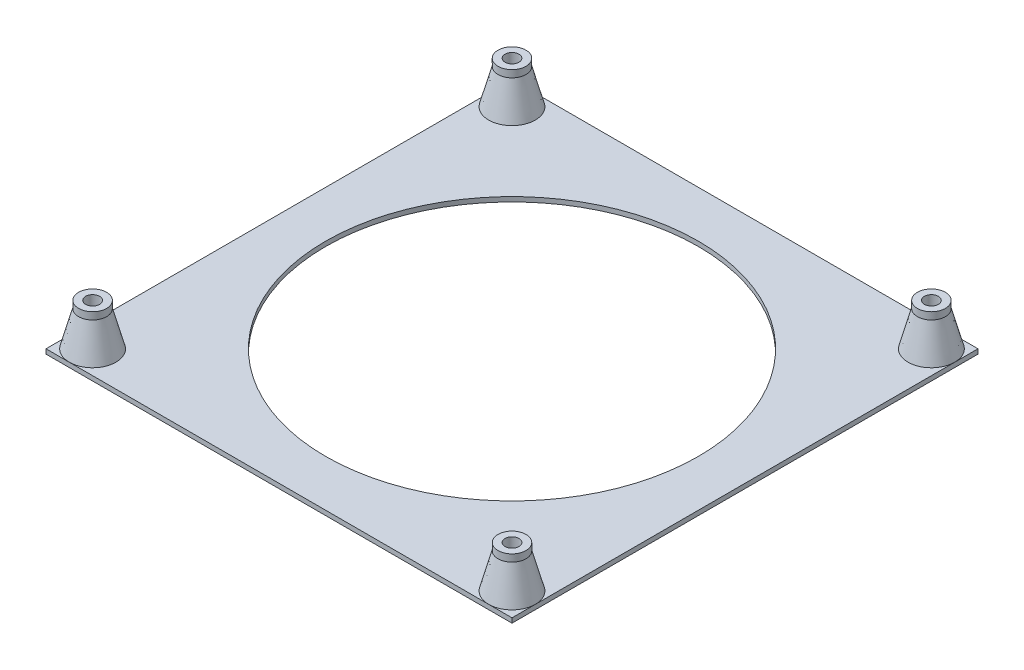
ISO-10303-21;
HEADER;
FILE_DESCRIPTION(('STEP AP214'),'2;1');
FILE_NAME('part.step','',(''),(''),'','','');
FILE_SCHEMA(('AUTOMOTIVE_DESIGN { 1 0 10303 214 1 1 1 1 }'));
ENDSEC;
DATA;
#1=APPLICATION_CONTEXT('core data for automotive mechanical design processes');
#2=APPLICATION_PROTOCOL_DEFINITION('international standard','automotive_design',2000,#1);
#3=PRODUCT_CONTEXT('',#1,'mechanical');
#4=PRODUCT('Part','Part','',(#3));
#5=PRODUCT_RELATED_PRODUCT_CATEGORY('part','',(#4));
#6=PRODUCT_DEFINITION_FORMATION('','',#4);
#7=PRODUCT_DEFINITION_CONTEXT('part definition',#1,'design');
#8=PRODUCT_DEFINITION('design','',#6,#7);
#9=PRODUCT_DEFINITION_SHAPE('','',#8);
#10=(LENGTH_UNIT() NAMED_UNIT(*) SI_UNIT(.MILLI.,.METRE.));
#11=(NAMED_UNIT(*) PLANE_ANGLE_UNIT() SI_UNIT($,.RADIAN.));
#12=(NAMED_UNIT(*) SI_UNIT($,.STERADIAN.) SOLID_ANGLE_UNIT());
#13=UNCERTAINTY_MEASURE_WITH_UNIT(LENGTH_MEASURE(1.E-05),#10,'distance_accuracy_value','');
#14=(GEOMETRIC_REPRESENTATION_CONTEXT(3) GLOBAL_UNCERTAINTY_ASSIGNED_CONTEXT((#13)) GLOBAL_UNIT_ASSIGNED_CONTEXT((#10,
#11,#12)) REPRESENTATION_CONTEXT('',''));
#15=CARTESIAN_POINT('',(0.,0.,0.));
#16=DIRECTION('',(0.,0.,1.));
#17=DIRECTION('',(1.,0.,0.));
#18=AXIS2_PLACEMENT_3D('',#15,#16,#17);
#19=CARTESIAN_POINT('',(0.,1.,0.));
#20=DIRECTION('',(0.,1.,0.));
#21=DIRECTION('',(0.,0.,1.));
#22=AXIS2_PLACEMENT_3D('',#19,#20,#21);
#23=PLANE('',#22);
#24=CARTESIAN_POINT('',(0.,1.,0.));
#25=DIRECTION('',(0.,1.,0.));
#26=DIRECTION('',(0.,0.,1.));
#27=AXIS2_PLACEMENT_3D('',#24,#25,#26);
#28=CIRCLE('',#27,40.);
#29=CARTESIAN_POINT('',(0.,1.,40.));
#30=VERTEX_POINT('',#29);
#31=EDGE_CURVE('E231',#30,#30,#28,.T.);
#32=ORIENTED_EDGE('',*,*,#31,.F.);
#33=EDGE_LOOP('',(#32));
#34=FACE_BOUND('',#33,.T.);
#35=DIRECTION('',(1.,0.,0.));
#36=VECTOR('',#35,1.);
#37=CARTESIAN_POINT('',(50.,1.,50.));
#38=LINE('',#37,#36);
#39=CARTESIAN_POINT('',(-45.,1.,50.));
#40=VERTEX_POINT('',#39);
#41=CARTESIAN_POINT('',(45.,1.,50.));
#42=VERTEX_POINT('',#41);
#43=EDGE_CURVE('E127',#40,#42,#38,.T.);
#44=ORIENTED_EDGE('',*,*,#43,.T.);
#45=CARTESIAN_POINT('',(45.,1.,45.));
#46=DIRECTION('',(0.,1.,0.));
#47=DIRECTION('',(0.,0.,1.));
#48=AXIS2_PLACEMENT_3D('',#45,#46,#47);
#49=CIRCLE('',#48,4.99999999999998);
#50=CARTESIAN_POINT('',(50.,1.,45.));
#51=VERTEX_POINT('',#50);
#52=EDGE_CURVE('E157',#42,#51,#49,.F.);
#53=ORIENTED_EDGE('',*,*,#52,.T.);
#54=DIRECTION('',(0.,0.,-1.));
#55=VECTOR('',#54,1.);
#56=CARTESIAN_POINT('',(50.,1.,50.));
#57=LINE('',#56,#55);
#58=CARTESIAN_POINT('',(50.,1.,-45.));
#59=VERTEX_POINT('',#58);
#60=EDGE_CURVE('E208',#51,#59,#57,.T.);
#61=ORIENTED_EDGE('',*,*,#60,.T.);
#62=CARTESIAN_POINT('',(45.,1.,-45.));
#63=DIRECTION('',(0.,1.,0.));
#64=DIRECTION('',(0.,0.,1.));
#65=AXIS2_PLACEMENT_3D('',#62,#63,#64);
#66=CIRCLE('',#65,4.99999999999998);
#67=CARTESIAN_POINT('',(45.,1.,-50.));
#68=VERTEX_POINT('',#67);
#69=EDGE_CURVE('E60',#59,#68,#66,.F.);
#70=ORIENTED_EDGE('',*,*,#69,.T.);
#71=DIRECTION('',(-1.,0.,0.));
#72=VECTOR('',#71,1.);
#73=CARTESIAN_POINT('',(50.,1.,-50.));
#74=LINE('',#73,#72);
#75=CARTESIAN_POINT('',(-45.,1.,-50.));
#76=VERTEX_POINT('',#75);
#77=EDGE_CURVE('E210',#68,#76,#74,.T.);
#78=ORIENTED_EDGE('',*,*,#77,.T.);
#79=CARTESIAN_POINT('',(-45.,1.,-45.));
#80=DIRECTION('',(0.,1.,0.));
#81=DIRECTION('',(0.,0.,1.));
#82=AXIS2_PLACEMENT_3D('',#79,#80,#81);
#83=CIRCLE('',#82,4.99999999999998);
#84=CARTESIAN_POINT('',(-50.,1.,-45.));
#85=VERTEX_POINT('',#84);
#86=EDGE_CURVE('E52',#76,#85,#83,.F.);
#87=ORIENTED_EDGE('',*,*,#86,.T.);
#88=DIRECTION('',(0.,0.,1.));
#89=VECTOR('',#88,1.);
#90=CARTESIAN_POINT('',(-50.,1.,50.));
#91=LINE('',#90,#89);
#92=CARTESIAN_POINT('',(-50.,1.,45.));
#93=VERTEX_POINT('',#92);
#94=EDGE_CURVE('E115',#85,#93,#91,.T.);
#95=ORIENTED_EDGE('',*,*,#94,.T.);
#96=CARTESIAN_POINT('',(-45.,1.,45.));
#97=DIRECTION('',(0.,1.,0.));
#98=DIRECTION('',(0.,0.,1.));
#99=AXIS2_PLACEMENT_3D('',#96,#97,#98);
#100=CIRCLE('',#99,4.99999999999998);
#101=EDGE_CURVE('E139',#93,#40,#100,.F.);
#102=ORIENTED_EDGE('',*,*,#101,.T.);
#103=EDGE_LOOP('',(#44,#53,#61,#70,#78,#87,#95,#102));
#104=FACE_BOUND('',#103,.T.);
#105=ADVANCED_FACE('F37',(#34,#104),#23,.T.);
#106=CARTESIAN_POINT('',(50.,1.,-50.));
#107=VERTEX_POINT('',#106);
#108=EDGE_CURVE('E212',#107,#68,#74,.T.);
#109=ORIENTED_EDGE('',*,*,#108,.T.);
#110=CARTESIAN_POINT('',(45.,1.,-45.));
#111=DIRECTION('',(0.,1.,0.));
#112=DIRECTION('',(0.,0.,1.));
#113=AXIS2_PLACEMENT_3D('',#110,#111,#112);
#114=CIRCLE('',#113,4.99999999999998);
#115=EDGE_CURVE('E152',#68,#59,#114,.F.);
#116=ORIENTED_EDGE('',*,*,#115,.T.);
#117=EDGE_CURVE('E128',#59,#107,#57,.T.);
#118=ORIENTED_EDGE('',*,*,#117,.T.);
#119=EDGE_LOOP('',(#109,#116,#118));
#120=FACE_BOUND('',#119,.T.);
#121=ADVANCED_FACE('F181',(#120),#23,.T.);
#122=CARTESIAN_POINT('',(-50.,1.,-50.));
#123=VERTEX_POINT('',#122);
#124=EDGE_CURVE('E118',#123,#85,#91,.T.);
#125=ORIENTED_EDGE('',*,*,#124,.T.);
#126=CARTESIAN_POINT('',(-45.,1.,-45.));
#127=DIRECTION('',(0.,1.,0.));
#128=DIRECTION('',(0.,0.,1.));
#129=AXIS2_PLACEMENT_3D('',#126,#127,#128);
#130=CIRCLE('',#129,4.99999999999998);
#131=EDGE_CURVE('E149',#85,#76,#130,.F.);
#132=ORIENTED_EDGE('',*,*,#131,.T.);
#133=EDGE_CURVE('E207',#76,#123,#74,.T.);
#134=ORIENTED_EDGE('',*,*,#133,.T.);
#135=EDGE_LOOP('',(#125,#132,#134));
#136=FACE_BOUND('',#135,.T.);
#137=ADVANCED_FACE('F188',(#136),#23,.T.);
#138=CARTESIAN_POINT('',(-50.,1.,50.));
#139=VERTEX_POINT('',#138);
#140=EDGE_CURVE('E108',#139,#40,#38,.T.);
#141=ORIENTED_EDGE('',*,*,#140,.T.);
#142=CARTESIAN_POINT('',(-45.,1.,45.));
#143=DIRECTION('',(0.,1.,0.));
#144=DIRECTION('',(0.,0.,1.));
#145=AXIS2_PLACEMENT_3D('',#142,#143,#144);
#146=CIRCLE('',#145,4.99999999999998);
#147=EDGE_CURVE('E110',#40,#93,#146,.F.);
#148=ORIENTED_EDGE('',*,*,#147,.T.);
#149=EDGE_CURVE('E105',#93,#139,#91,.T.);
#150=ORIENTED_EDGE('',*,*,#149,.T.);
#151=EDGE_LOOP('',(#141,#148,#150));
#152=FACE_BOUND('',#151,.T.);
#153=ADVANCED_FACE('F107',(#152),#23,.T.);
#154=CARTESIAN_POINT('',(50.,1.,50.));
#155=VERTEX_POINT('',#154);
#156=EDGE_CURVE('E203',#155,#51,#57,.T.);
#157=ORIENTED_EDGE('',*,*,#156,.T.);
#158=CARTESIAN_POINT('',(45.,1.,45.));
#159=DIRECTION('',(0.,1.,0.));
#160=DIRECTION('',(0.,0.,1.));
#161=AXIS2_PLACEMENT_3D('',#158,#159,#160);
#162=CIRCLE('',#161,4.99999999999998);
#163=EDGE_CURVE('E155',#51,#42,#162,.F.);
#164=ORIENTED_EDGE('',*,*,#163,.T.);
#165=EDGE_CURVE('E130',#42,#155,#38,.T.);
#166=ORIENTED_EDGE('',*,*,#165,.T.);
#167=EDGE_LOOP('',(#157,#164,#166));
#168=FACE_BOUND('',#167,.T.);
#169=ADVANCED_FACE('F184',(#168),#23,.T.);
#170=CARTESIAN_POINT('',(0.,0.,0.));
#171=DIRECTION('',(0.,1.,0.));
#172=DIRECTION('',(0.,0.,1.));
#173=AXIS2_PLACEMENT_3D('',#170,#171,#172);
#174=PLANE('',#173);
#175=CARTESIAN_POINT('',(-45.,0.,-45.));
#176=DIRECTION('',(0.,1.,0.));
#177=DIRECTION('',(0.,0.,1.));
#178=AXIS2_PLACEMENT_3D('',#175,#176,#177);
#179=CIRCLE('',#178,1.5);
#180=CARTESIAN_POINT('',(-45.,0.,-43.5));
#181=VERTEX_POINT('',#180);
#182=EDGE_CURVE('E501',#181,#181,#179,.T.);
#183=ORIENTED_EDGE('',*,*,#182,.T.);
#184=EDGE_LOOP('',(#183));
#185=FACE_BOUND('',#184,.T.);
#186=CARTESIAN_POINT('',(45.,0.,-45.));
#187=DIRECTION('',(0.,1.,0.));
#188=DIRECTION('',(0.,0.,1.));
#189=AXIS2_PLACEMENT_3D('',#186,#187,#188);
#190=CIRCLE('',#189,1.5);
#191=CARTESIAN_POINT('',(45.,0.,-43.5));
#192=VERTEX_POINT('',#191);
#193=EDGE_CURVE('E488',#192,#192,#190,.T.);
#194=ORIENTED_EDGE('',*,*,#193,.T.);
#195=EDGE_LOOP('',(#194));
#196=FACE_BOUND('',#195,.T.);
#197=CARTESIAN_POINT('',(45.,0.,45.));
#198=DIRECTION('',(0.,1.,0.));
#199=DIRECTION('',(0.,0.,1.));
#200=AXIS2_PLACEMENT_3D('',#197,#198,#199);
#201=CIRCLE('',#200,1.5);
#202=CARTESIAN_POINT('',(45.,0.,46.5));
#203=VERTEX_POINT('',#202);
#204=EDGE_CURVE('E258',#203,#203,#201,.T.);
#205=ORIENTED_EDGE('',*,*,#204,.T.);
#206=EDGE_LOOP('',(#205));
#207=FACE_BOUND('',#206,.T.);
#208=CARTESIAN_POINT('',(-45.,0.,45.));
#209=DIRECTION('',(0.,1.,0.));
#210=DIRECTION('',(0.,0.,1.));
#211=AXIS2_PLACEMENT_3D('',#208,#209,#210);
#212=CIRCLE('',#211,1.5);
#213=CARTESIAN_POINT('',(-45.,0.,46.5));
#214=VERTEX_POINT('',#213);
#215=EDGE_CURVE('E261',#214,#214,#212,.T.);
#216=ORIENTED_EDGE('',*,*,#215,.T.);
#217=EDGE_LOOP('',(#216));
#218=FACE_BOUND('',#217,.T.);
#219=DIRECTION('',(0.,0.,1.));
#220=VECTOR('',#219,1.);
#221=CARTESIAN_POINT('',(-50.,0.,50.));
#222=LINE('',#221,#220);
#223=CARTESIAN_POINT('',(-50.,0.,-50.));
#224=VERTEX_POINT('',#223);
#225=CARTESIAN_POINT('',(-50.,0.,50.));
#226=VERTEX_POINT('',#225);
#227=EDGE_CURVE('E134',#224,#226,#222,.T.);
#228=ORIENTED_EDGE('',*,*,#227,.F.);
#229=DIRECTION('',(-1.,0.,0.));
#230=VECTOR('',#229,1.);
#231=CARTESIAN_POINT('',(50.,0.,-50.));
#232=LINE('',#231,#230);
#233=CARTESIAN_POINT('',(50.,0.,-50.));
#234=VERTEX_POINT('',#233);
#235=EDGE_CURVE('E116',#234,#224,#232,.T.);
#236=ORIENTED_EDGE('',*,*,#235,.F.);
#237=DIRECTION('',(0.,0.,-1.));
#238=VECTOR('',#237,1.);
#239=CARTESIAN_POINT('',(50.,0.,50.));
#240=LINE('',#239,#238);
#241=CARTESIAN_POINT('',(50.,0.,50.));
#242=VERTEX_POINT('',#241);
#243=EDGE_CURVE('E221',#242,#234,#240,.T.);
#244=ORIENTED_EDGE('',*,*,#243,.F.);
#245=DIRECTION('',(1.,0.,0.));
#246=VECTOR('',#245,1.);
#247=CARTESIAN_POINT('',(50.,0.,50.));
#248=LINE('',#247,#246);
#249=EDGE_CURVE('E230',#226,#242,#248,.T.);
#250=ORIENTED_EDGE('',*,*,#249,.F.);
#251=EDGE_LOOP('',(#228,#236,#244,#250));
#252=FACE_BOUND('',#251,.T.);
#253=CARTESIAN_POINT('',(0.,0.,0.));
#254=DIRECTION('',(0.,1.,0.));
#255=DIRECTION('',(0.,0.,1.));
#256=AXIS2_PLACEMENT_3D('',#253,#254,#255);
#257=CIRCLE('',#256,40.);
#258=CARTESIAN_POINT('',(0.,0.,40.));
#259=VERTEX_POINT('',#258);
#260=EDGE_CURVE('E273',#259,#259,#257,.T.);
#261=ORIENTED_EDGE('',*,*,#260,.T.);
#262=EDGE_LOOP('',(#261));
#263=FACE_BOUND('',#262,.T.);
#264=ADVANCED_FACE('F194',(#185,#196,#207,#218,#252,#263),#174,.F.);
#265=CARTESIAN_POINT('',(-50.,1.,50.));
#266=DIRECTION('',(1.,0.,0.));
#267=DIRECTION('',(0.,0.,-1.));
#268=AXIS2_PLACEMENT_3D('',#265,#266,#267);
#269=PLANE('',#268);
#270=ORIENTED_EDGE('',*,*,#227,.T.);
#271=DIRECTION('',(0.,-1.,0.));
#272=VECTOR('',#271,1.);
#273=CARTESIAN_POINT('',(-50.,1.,50.));
#274=LINE('',#273,#272);
#275=EDGE_CURVE('E123',#139,#226,#274,.T.);
#276=ORIENTED_EDGE('',*,*,#275,.F.);
#277=ORIENTED_EDGE('',*,*,#149,.F.);
#278=ORIENTED_EDGE('',*,*,#94,.F.);
#279=ORIENTED_EDGE('',*,*,#124,.F.);
#280=DIRECTION('',(0.,-1.,0.));
#281=VECTOR('',#280,1.);
#282=CARTESIAN_POINT('',(-50.,1.,-50.));
#283=LINE('',#282,#281);
#284=EDGE_CURVE('E224',#123,#224,#283,.T.);
#285=ORIENTED_EDGE('',*,*,#284,.T.);
#286=EDGE_LOOP('',(#270,#276,#277,#278,#279,#285));
#287=FACE_BOUND('',#286,.T.);
#288=ADVANCED_FACE('F131',(#287),#269,.F.);
#289=CARTESIAN_POINT('',(50.,1.,50.));
#290=DIRECTION('',(0.,0.,-1.));
#291=DIRECTION('',(-1.,0.,0.));
#292=AXIS2_PLACEMENT_3D('',#289,#290,#291);
#293=PLANE('',#292);
#294=ORIENTED_EDGE('',*,*,#249,.T.);
#295=DIRECTION('',(0.,-1.,0.));
#296=VECTOR('',#295,1.);
#297=CARTESIAN_POINT('',(50.,1.,50.));
#298=LINE('',#297,#296);
#299=EDGE_CURVE('E136',#155,#242,#298,.T.);
#300=ORIENTED_EDGE('',*,*,#299,.F.);
#301=ORIENTED_EDGE('',*,*,#165,.F.);
#302=ORIENTED_EDGE('',*,*,#43,.F.);
#303=ORIENTED_EDGE('',*,*,#140,.F.);
#304=ORIENTED_EDGE('',*,*,#275,.T.);
#305=EDGE_LOOP('',(#294,#300,#301,#302,#303,#304));
#306=FACE_BOUND('',#305,.T.);
#307=ADVANCED_FACE('F122',(#306),#293,.F.);
#308=CARTESIAN_POINT('',(50.,1.,50.));
#309=DIRECTION('',(-1.,0.,0.));
#310=DIRECTION('',(0.,0.,1.));
#311=AXIS2_PLACEMENT_3D('',#308,#309,#310);
#312=PLANE('',#311);
#313=ORIENTED_EDGE('',*,*,#243,.T.);
#314=DIRECTION('',(0.,-1.,0.));
#315=VECTOR('',#314,1.);
#316=CARTESIAN_POINT('',(50.,1.,-50.));
#317=LINE('',#316,#315);
#318=EDGE_CURVE('E142',#107,#234,#317,.T.);
#319=ORIENTED_EDGE('',*,*,#318,.F.);
#320=ORIENTED_EDGE('',*,*,#117,.F.);
#321=ORIENTED_EDGE('',*,*,#60,.F.);
#322=ORIENTED_EDGE('',*,*,#156,.F.);
#323=ORIENTED_EDGE('',*,*,#299,.T.);
#324=EDGE_LOOP('',(#313,#319,#320,#321,#322,#323));
#325=FACE_BOUND('',#324,.T.);
#326=ADVANCED_FACE('F219',(#325),#312,.F.);
#327=CARTESIAN_POINT('',(50.,1.,-50.));
#328=DIRECTION('',(0.,0.,1.));
#329=DIRECTION('',(1.,0.,0.));
#330=AXIS2_PLACEMENT_3D('',#327,#328,#329);
#331=PLANE('',#330);
#332=ORIENTED_EDGE('',*,*,#235,.T.);
#333=ORIENTED_EDGE('',*,*,#284,.F.);
#334=ORIENTED_EDGE('',*,*,#133,.F.);
#335=ORIENTED_EDGE('',*,*,#77,.F.);
#336=ORIENTED_EDGE('',*,*,#108,.F.);
#337=ORIENTED_EDGE('',*,*,#318,.T.);
#338=EDGE_LOOP('',(#332,#333,#334,#335,#336,#337));
#339=FACE_BOUND('',#338,.T.);
#340=ADVANCED_FACE('F225',(#339),#331,.F.);
#341=CARTESIAN_POINT('',(0.,1.,0.));
#342=DIRECTION('',(0.,-1.,0.));
#343=DIRECTION('',(0.,0.,-1.));
#344=AXIS2_PLACEMENT_3D('',#341,#342,#343);
#345=CYLINDRICAL_SURFACE('',#344,40.);
#346=ORIENTED_EDGE('',*,*,#31,.T.);
#347=EDGE_LOOP('',(#346));
#348=FACE_BOUND('',#347,.T.);
#349=ORIENTED_EDGE('',*,*,#260,.F.);
#350=EDGE_LOOP('',(#349));
#351=FACE_BOUND('',#350,.T.);
#352=ADVANCED_FACE('F326',(#348,#351),#345,.F.);
#353=CARTESIAN_POINT('',(-45.,10.,45.));
#354=DIRECTION('',(0.,-1.,0.));
#355=DIRECTION('',(0.,0.,-1.));
#356=AXIS2_PLACEMENT_3D('',#353,#354,#355);
#357=CYLINDRICAL_SURFACE('',#356,3.);
#358=CARTESIAN_POINT('',(-45.,8.46410161513788,45.));
#359=DIRECTION('',(0.,1.,0.));
#360=DIRECTION('',(0.,0.,1.));
#361=AXIS2_PLACEMENT_3D('',#358,#359,#360);
#362=CIRCLE('',#361,3.);
#363=CARTESIAN_POINT('',(-45.,8.46410161513788,48.));
#364=VERTEX_POINT('',#363);
#365=EDGE_CURVE('E11',#364,#364,#362,.T.);
#366=ORIENTED_EDGE('',*,*,#365,.T.);
#367=EDGE_LOOP('',(#366));
#368=FACE_BOUND('',#367,.T.);
#369=CARTESIAN_POINT('',(-45.,10.,45.));
#370=DIRECTION('',(0.,1.,0.));
#371=DIRECTION('',(0.,0.,1.));
#372=AXIS2_PLACEMENT_3D('',#369,#370,#371);
#373=CIRCLE('',#372,3.);
#374=CARTESIAN_POINT('',(-45.,10.,48.));
#375=VERTEX_POINT('',#374);
#376=EDGE_CURVE('E269',#375,#375,#373,.T.);
#377=ORIENTED_EDGE('',*,*,#376,.F.);
#378=EDGE_LOOP('',(#377));
#379=FACE_BOUND('',#378,.T.);
#380=ADVANCED_FACE('F333',(#368,#379),#357,.T.);
#381=CARTESIAN_POINT('',(0.,10.,0.));
#382=DIRECTION('',(0.,1.,0.));
#383=DIRECTION('',(0.,0.,1.));
#384=AXIS2_PLACEMENT_3D('',#381,#382,#383);
#385=PLANE('',#384);
#386=CARTESIAN_POINT('',(-45.,10.,45.));
#387=DIRECTION('',(0.,1.,0.));
#388=DIRECTION('',(0.,0.,1.));
#389=AXIS2_PLACEMENT_3D('',#386,#387,#388);
#390=CIRCLE('',#389,1.5);
#391=CARTESIAN_POINT('',(-45.,10.,46.5));
#392=VERTEX_POINT('',#391);
#393=EDGE_CURVE('E257',#392,#392,#390,.T.);
#394=ORIENTED_EDGE('',*,*,#393,.F.);
#395=EDGE_LOOP('',(#394));
#396=FACE_BOUND('',#395,.T.);
#397=ORIENTED_EDGE('',*,*,#376,.T.);
#398=EDGE_LOOP('',(#397));
#399=FACE_BOUND('',#398,.T.);
#400=ADVANCED_FACE('F338',(#396,#399),#385,.T.);
#401=CARTESIAN_POINT('',(-45.,0.,45.));
#402=DIRECTION('',(0.,1.,0.));
#403=DIRECTION('',(0.,0.,1.));
#404=AXIS2_PLACEMENT_3D('',#401,#402,#403);
#405=CYLINDRICAL_SURFACE('',#404,1.5);
#406=ORIENTED_EDGE('',*,*,#215,.F.);
#407=EDGE_LOOP('',(#406));
#408=FACE_BOUND('',#407,.T.);
#409=ORIENTED_EDGE('',*,*,#393,.T.);
#410=EDGE_LOOP('',(#409));
#411=FACE_BOUND('',#410,.T.);
#412=ADVANCED_FACE('F251',(#408,#411),#405,.F.);
#413=CARTESIAN_POINT('',(45.,10.,45.));
#414=DIRECTION('',(0.,-1.,0.));
#415=DIRECTION('',(0.,0.,-1.));
#416=AXIS2_PLACEMENT_3D('',#413,#414,#415);
#417=CYLINDRICAL_SURFACE('',#416,3.);
#418=CARTESIAN_POINT('',(45.,8.46410161513788,45.));
#419=DIRECTION('',(0.,1.,0.));
#420=DIRECTION('',(0.,0.,1.));
#421=AXIS2_PLACEMENT_3D('',#418,#419,#420);
#422=CIRCLE('',#421,3.);
#423=CARTESIAN_POINT('',(45.,8.46410161513788,48.));
#424=VERTEX_POINT('',#423);
#425=EDGE_CURVE('E135',#424,#424,#422,.T.);
#426=ORIENTED_EDGE('',*,*,#425,.T.);
#427=EDGE_LOOP('',(#426));
#428=FACE_BOUND('',#427,.T.);
#429=CARTESIAN_POINT('',(45.,10.,45.));
#430=DIRECTION('',(0.,-1.,0.));
#431=DIRECTION('',(0.,0.,1.));
#432=AXIS2_PLACEMENT_3D('',#429,#430,#431);
#433=CIRCLE('',#432,3.);
#434=CARTESIAN_POINT('',(45.,10.,48.));
#435=VERTEX_POINT('',#434);
#436=EDGE_CURVE('E255',#435,#435,#433,.T.);
#437=ORIENTED_EDGE('',*,*,#436,.T.);
#438=EDGE_LOOP('',(#437));
#439=FACE_BOUND('',#438,.T.);
#440=ADVANCED_FACE('F247',(#428,#439),#417,.T.);
#441=CARTESIAN_POINT('',(0.,10.,0.));
#442=DIRECTION('',(0.,1.,0.));
#443=DIRECTION('',(0.,0.,1.));
#444=AXIS2_PLACEMENT_3D('',#441,#442,#443);
#445=PLANE('',#444);
#446=CARTESIAN_POINT('',(45.,10.,45.));
#447=DIRECTION('',(0.,1.,0.));
#448=DIRECTION('',(0.,0.,1.));
#449=AXIS2_PLACEMENT_3D('',#446,#447,#448);
#450=CIRCLE('',#449,1.5);
#451=CARTESIAN_POINT('',(45.,10.,46.5));
#452=VERTEX_POINT('',#451);
#453=EDGE_CURVE('E264',#452,#452,#450,.T.);
#454=ORIENTED_EDGE('',*,*,#453,.F.);
#455=EDGE_LOOP('',(#454));
#456=FACE_BOUND('',#455,.T.);
#457=ORIENTED_EDGE('',*,*,#436,.F.);
#458=EDGE_LOOP('',(#457));
#459=FACE_BOUND('',#458,.T.);
#460=ADVANCED_FACE('F250',(#456,#459),#445,.T.);
#461=CARTESIAN_POINT('',(45.,0.,45.));
#462=DIRECTION('',(0.,1.,0.));
#463=DIRECTION('',(0.,0.,1.));
#464=AXIS2_PLACEMENT_3D('',#461,#462,#463);
#465=CYLINDRICAL_SURFACE('',#464,1.5);
#466=ORIENTED_EDGE('',*,*,#204,.F.);
#467=EDGE_LOOP('',(#466));
#468=FACE_BOUND('',#467,.T.);
#469=ORIENTED_EDGE('',*,*,#453,.T.);
#470=EDGE_LOOP('',(#469));
#471=FACE_BOUND('',#470,.T.);
#472=ADVANCED_FACE('F362',(#468,#471),#465,.F.);
#473=CARTESIAN_POINT('',(45.,10.,-45.));
#474=DIRECTION('',(0.,-1.,0.));
#475=DIRECTION('',(0.,0.,-1.));
#476=AXIS2_PLACEMENT_3D('',#473,#474,#475);
#477=CYLINDRICAL_SURFACE('',#476,3.);
#478=CARTESIAN_POINT('',(45.,8.46410161513788,-45.));
#479=DIRECTION('',(0.,1.,0.));
#480=DIRECTION('',(0.,0.,1.));
#481=AXIS2_PLACEMENT_3D('',#478,#479,#480);
#482=CIRCLE('',#481,3.);
#483=CARTESIAN_POINT('',(45.,8.46410161513788,-42.));
#484=VERTEX_POINT('',#483);
#485=EDGE_CURVE('E160',#484,#484,#482,.T.);
#486=ORIENTED_EDGE('',*,*,#485,.T.);
#487=EDGE_LOOP('',(#486));
#488=FACE_BOUND('',#487,.T.);
#489=CARTESIAN_POINT('',(45.,10.,-45.));
#490=DIRECTION('',(0.,1.,0.));
#491=DIRECTION('',(0.,0.,-1.));
#492=AXIS2_PLACEMENT_3D('',#489,#490,#491);
#493=CIRCLE('',#492,3.);
#494=CARTESIAN_POINT('',(45.,10.,-48.));
#495=VERTEX_POINT('',#494);
#496=EDGE_CURVE('E486',#495,#495,#493,.T.);
#497=ORIENTED_EDGE('',*,*,#496,.F.);
#498=EDGE_LOOP('',(#497));
#499=FACE_BOUND('',#498,.T.);
#500=ADVANCED_FACE('F356',(#488,#499),#477,.T.);
#501=CARTESIAN_POINT('',(0.,10.,0.));
#502=DIRECTION('',(0.,1.,0.));
#503=DIRECTION('',(0.,0.,-1.));
#504=AXIS2_PLACEMENT_3D('',#501,#502,#503);
#505=PLANE('',#504);
#506=CARTESIAN_POINT('',(45.,10.,-45.));
#507=DIRECTION('',(0.,1.,0.));
#508=DIRECTION('',(0.,0.,1.));
#509=AXIS2_PLACEMENT_3D('',#506,#507,#508);
#510=CIRCLE('',#509,1.5);
#511=CARTESIAN_POINT('',(45.,10.,-43.5));
#512=VERTEX_POINT('',#511);
#513=EDGE_CURVE('E493',#512,#512,#510,.T.);
#514=ORIENTED_EDGE('',*,*,#513,.F.);
#515=EDGE_LOOP('',(#514));
#516=FACE_BOUND('',#515,.T.);
#517=ORIENTED_EDGE('',*,*,#496,.T.);
#518=EDGE_LOOP('',(#517));
#519=FACE_BOUND('',#518,.T.);
#520=ADVANCED_FACE('F361',(#516,#519),#505,.T.);
#521=CARTESIAN_POINT('',(45.,0.,-45.));
#522=DIRECTION('',(0.,1.,0.));
#523=DIRECTION('',(0.,0.,1.));
#524=AXIS2_PLACEMENT_3D('',#521,#522,#523);
#525=CYLINDRICAL_SURFACE('',#524,1.5);
#526=ORIENTED_EDGE('',*,*,#193,.F.);
#527=EDGE_LOOP('',(#526));
#528=FACE_BOUND('',#527,.T.);
#529=ORIENTED_EDGE('',*,*,#513,.T.);
#530=EDGE_LOOP('',(#529));
#531=FACE_BOUND('',#530,.T.);
#532=ADVANCED_FACE('F377',(#528,#531),#525,.F.);
#533=CARTESIAN_POINT('',(-45.,10.,-45.));
#534=DIRECTION('',(0.,-1.,0.));
#535=DIRECTION('',(0.,0.,-1.));
#536=AXIS2_PLACEMENT_3D('',#533,#534,#535);
#537=CYLINDRICAL_SURFACE('',#536,3.);
#538=CARTESIAN_POINT('',(-45.,8.46410161513788,-45.));
#539=DIRECTION('',(0.,1.,0.));
#540=DIRECTION('',(0.,0.,1.));
#541=AXIS2_PLACEMENT_3D('',#538,#539,#540);
#542=CIRCLE('',#541,3.);
#543=CARTESIAN_POINT('',(-45.,8.46410161513788,-42.));
#544=VERTEX_POINT('',#543);
#545=EDGE_CURVE('E46',#544,#544,#542,.T.);
#546=ORIENTED_EDGE('',*,*,#545,.T.);
#547=EDGE_LOOP('',(#546));
#548=FACE_BOUND('',#547,.T.);
#549=CARTESIAN_POINT('',(-45.,10.,-45.));
#550=DIRECTION('',(0.,-1.,0.));
#551=DIRECTION('',(0.,0.,-1.));
#552=AXIS2_PLACEMENT_3D('',#549,#550,#551);
#553=CIRCLE('',#552,3.);
#554=CARTESIAN_POINT('',(-45.,10.,-48.));
#555=VERTEX_POINT('',#554);
#556=EDGE_CURVE('E497',#555,#555,#553,.T.);
#557=ORIENTED_EDGE('',*,*,#556,.T.);
#558=EDGE_LOOP('',(#557));
#559=FACE_BOUND('',#558,.T.);
#560=ADVANCED_FACE('F165',(#548,#559),#537,.T.);
#561=CARTESIAN_POINT('',(0.,10.,0.));
#562=DIRECTION('',(0.,1.,0.));
#563=DIRECTION('',(0.,0.,-1.));
#564=AXIS2_PLACEMENT_3D('',#561,#562,#563);
#565=PLANE('',#564);
#566=CARTESIAN_POINT('',(-45.,10.,-45.));
#567=DIRECTION('',(0.,1.,0.));
#568=DIRECTION('',(0.,0.,1.));
#569=AXIS2_PLACEMENT_3D('',#566,#567,#568);
#570=CIRCLE('',#569,1.5);
#571=CARTESIAN_POINT('',(-45.,10.,-43.5));
#572=VERTEX_POINT('',#571);
#573=EDGE_CURVE('E502',#572,#572,#570,.T.);
#574=ORIENTED_EDGE('',*,*,#573,.F.);
#575=EDGE_LOOP('',(#574));
#576=FACE_BOUND('',#575,.T.);
#577=ORIENTED_EDGE('',*,*,#556,.F.);
#578=EDGE_LOOP('',(#577));
#579=FACE_BOUND('',#578,.T.);
#580=ADVANCED_FACE('F376',(#576,#579),#565,.T.);
#581=CARTESIAN_POINT('',(-45.,0.,-45.));
#582=DIRECTION('',(0.,1.,0.));
#583=DIRECTION('',(0.,0.,1.));
#584=AXIS2_PLACEMENT_3D('',#581,#582,#583);
#585=CYLINDRICAL_SURFACE('',#584,1.5);
#586=ORIENTED_EDGE('',*,*,#182,.F.);
#587=EDGE_LOOP('',(#586));
#588=FACE_BOUND('',#587,.T.);
#589=ORIENTED_EDGE('',*,*,#573,.T.);
#590=EDGE_LOOP('',(#589));
#591=FACE_BOUND('',#590,.T.);
#592=ADVANCED_FACE('F243',(#588,#591),#585,.F.);
#593=CARTESIAN_POINT('',(45.,8.46410161513788,45.));
#594=DIRECTION('',(0.,-1.,0.));
#595=DIRECTION('',(0.,0.,-1.));
#596=AXIS2_PLACEMENT_3D('',#593,#594,#595);
#597=CONICAL_SURFACE('',#596,3.,0.261799387799143);
#598=ORIENTED_EDGE('',*,*,#163,.F.);
#599=ORIENTED_EDGE('',*,*,#52,.F.);
#600=EDGE_LOOP('',(#598,#599));
#601=FACE_BOUND('',#600,.T.);
#602=ORIENTED_EDGE('',*,*,#425,.F.);
#603=EDGE_LOOP('',(#602));
#604=FACE_BOUND('',#603,.T.);
#605=ADVANCED_FACE('F176',(#601,#604),#597,.T.);
#606=CARTESIAN_POINT('',(45.,8.46410161513788,-45.));
#607=DIRECTION('',(0.,-1.,0.));
#608=DIRECTION('',(0.,0.,-1.));
#609=AXIS2_PLACEMENT_3D('',#606,#607,#608);
#610=CONICAL_SURFACE('',#609,3.,0.261799387799143);
#611=ORIENTED_EDGE('',*,*,#69,.F.);
#612=ORIENTED_EDGE('',*,*,#115,.F.);
#613=EDGE_LOOP('',(#611,#612));
#614=FACE_BOUND('',#613,.T.);
#615=ORIENTED_EDGE('',*,*,#485,.F.);
#616=EDGE_LOOP('',(#615));
#617=FACE_BOUND('',#616,.T.);
#618=ADVANCED_FACE('F170',(#614,#617),#610,.T.);
#619=CARTESIAN_POINT('',(-45.,8.46410161513788,-45.));
#620=DIRECTION('',(0.,-1.,0.));
#621=DIRECTION('',(0.,0.,-1.));
#622=AXIS2_PLACEMENT_3D('',#619,#620,#621);
#623=CONICAL_SURFACE('',#622,3.,0.261799387799143);
#624=ORIENTED_EDGE('',*,*,#86,.F.);
#625=ORIENTED_EDGE('',*,*,#131,.F.);
#626=EDGE_LOOP('',(#624,#625));
#627=FACE_BOUND('',#626,.T.);
#628=ORIENTED_EDGE('',*,*,#545,.F.);
#629=EDGE_LOOP('',(#628));
#630=FACE_BOUND('',#629,.T.);
#631=ADVANCED_FACE('F168',(#627,#630),#623,.T.);
#632=CARTESIAN_POINT('',(-45.,8.46410161513788,45.));
#633=DIRECTION('',(0.,-1.,0.));
#634=DIRECTION('',(0.,0.,-1.));
#635=AXIS2_PLACEMENT_3D('',#632,#633,#634);
#636=CONICAL_SURFACE('',#635,3.,0.261799387799143);
#637=ORIENTED_EDGE('',*,*,#101,.F.);
#638=ORIENTED_EDGE('',*,*,#147,.F.);
#639=EDGE_LOOP('',(#637,#638));
#640=FACE_BOUND('',#639,.T.);
#641=ORIENTED_EDGE('',*,*,#365,.F.);
#642=EDGE_LOOP('',(#641));
#643=FACE_BOUND('',#642,.T.);
#644=ADVANCED_FACE('F40',(#640,#643),#636,.T.);
#645=CLOSED_SHELL('',(#105,#121,#137,#153,#169,#264,#288,#307,#326,#340,#352,#380,#400,#412,
#440,#460,#472,#500,#520,#532,#560,#580,#592,#605,#618,#631,#644));
#646=MANIFOLD_SOLID_BREP('B2',#645);
#647=ADVANCED_BREP_SHAPE_REPRESENTATION('',(#18,#646),#14);
#648=SHAPE_DEFINITION_REPRESENTATION(#9,#647);
ENDSEC;
END-ISO-10303-21;
